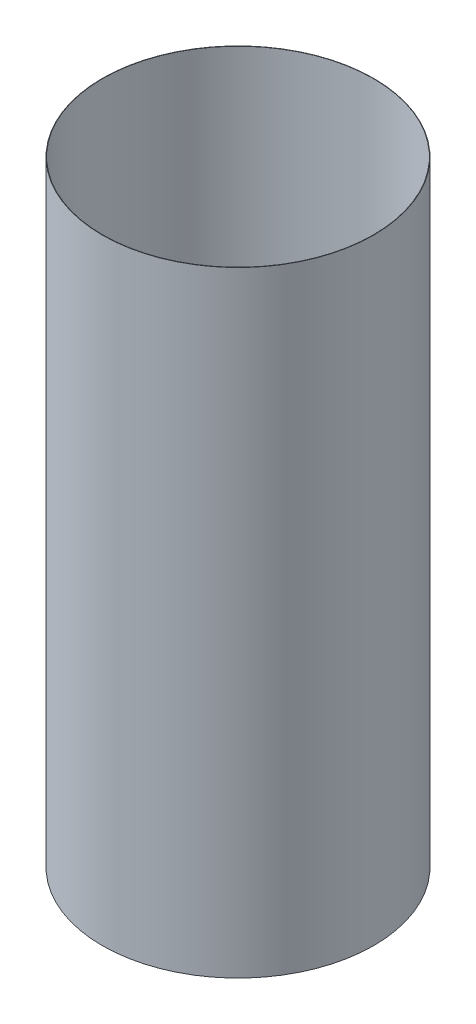
ISO-10303-21;
HEADER;
FILE_DESCRIPTION(('STEP AP214'),'2;1');
FILE_NAME('part.step','',(''),(''),'','','');
FILE_SCHEMA(('AUTOMOTIVE_DESIGN { 1 0 10303 214 1 1 1 1 }'));
ENDSEC;
DATA;
#1=APPLICATION_CONTEXT('core data for automotive mechanical design processes');
#2=APPLICATION_PROTOCOL_DEFINITION('international standard','automotive_design',2000,#1);
#3=PRODUCT_CONTEXT('',#1,'mechanical');
#4=PRODUCT('Part','Part','',(#3));
#5=PRODUCT_RELATED_PRODUCT_CATEGORY('part','',(#4));
#6=PRODUCT_DEFINITION_FORMATION('','',#4);
#7=PRODUCT_DEFINITION_CONTEXT('part definition',#1,'design');
#8=PRODUCT_DEFINITION('design','',#6,#7);
#9=PRODUCT_DEFINITION_SHAPE('','',#8);
#10=(LENGTH_UNIT() NAMED_UNIT(*) SI_UNIT(.MILLI.,.METRE.));
#11=(NAMED_UNIT(*) PLANE_ANGLE_UNIT() SI_UNIT($,.RADIAN.));
#12=(NAMED_UNIT(*) SI_UNIT($,.STERADIAN.) SOLID_ANGLE_UNIT());
#13=UNCERTAINTY_MEASURE_WITH_UNIT(LENGTH_MEASURE(1.E-05),#10,'distance_accuracy_value','');
#14=(GEOMETRIC_REPRESENTATION_CONTEXT(3) GLOBAL_UNCERTAINTY_ASSIGNED_CONTEXT((#13)) GLOBAL_UNIT_ASSIGNED_CONTEXT((#10,
#11,#12)) REPRESENTATION_CONTEXT('',''));
#15=CARTESIAN_POINT('',(0.,0.,0.));
#16=DIRECTION('',(0.,0.,1.));
#17=DIRECTION('',(1.,0.,0.));
#18=AXIS2_PLACEMENT_3D('',#15,#16,#17);
#19=CARTESIAN_POINT('',(0.,107.95,0.));
#20=DIRECTION('',(0.,1.,0.));
#21=DIRECTION('',(0.,0.,1.));
#22=AXIS2_PLACEMENT_3D('',#19,#20,#21);
#23=PLANE('',#22);
#24=CARTESIAN_POINT('',(0.,107.95,0.));
#25=DIRECTION('',(0.,1.,0.));
#26=DIRECTION('',(0.,0.,1.));
#27=AXIS2_PLACEMENT_3D('',#24,#25,#26);
#28=CIRCLE('',#27,23.8125);
#29=CARTESIAN_POINT('',(0.,107.95,23.8125));
#30=VERTEX_POINT('',#29);
#31=EDGE_CURVE('E10',#30,#30,#28,.T.);
#32=ORIENTED_EDGE('',*,*,#31,.T.);
#33=EDGE_LOOP('',(#32));
#34=FACE_BOUND('',#33,.T.);
#35=CARTESIAN_POINT('',(0.,107.95,0.));
#36=DIRECTION('',(0.,1.,0.));
#37=DIRECTION('',(0.,0.,1.));
#38=AXIS2_PLACEMENT_3D('',#35,#36,#37);
#39=CIRCLE('',#38,23.749);
#40=CARTESIAN_POINT('',(0.,107.95,23.749));
#41=VERTEX_POINT('',#40);
#42=EDGE_CURVE('E48',#41,#41,#39,.T.);
#43=ORIENTED_EDGE('',*,*,#42,.F.);
#44=EDGE_LOOP('',(#43));
#45=FACE_BOUND('',#44,.T.);
#46=ADVANCED_FACE('F37',(#34,#45),#23,.T.);
#47=CARTESIAN_POINT('',(0.,0.,0.));
#48=DIRECTION('',(0.,1.,0.));
#49=DIRECTION('',(0.,0.,1.));
#50=AXIS2_PLACEMENT_3D('',#47,#48,#49);
#51=PLANE('',#50);
#52=CARTESIAN_POINT('',(0.,0.,0.));
#53=DIRECTION('',(0.,1.,0.));
#54=DIRECTION('',(0.,0.,1.));
#55=AXIS2_PLACEMENT_3D('',#52,#53,#54);
#56=CIRCLE('',#55,23.8125);
#57=CARTESIAN_POINT('',(0.,0.,23.8125));
#58=VERTEX_POINT('',#57);
#59=EDGE_CURVE('E41',#58,#58,#56,.T.);
#60=ORIENTED_EDGE('',*,*,#59,.F.);
#61=EDGE_LOOP('',(#60));
#62=FACE_BOUND('',#61,.T.);
#63=CARTESIAN_POINT('',(0.,0.,0.));
#64=DIRECTION('',(0.,1.,0.));
#65=DIRECTION('',(0.,0.,1.));
#66=AXIS2_PLACEMENT_3D('',#63,#64,#65);
#67=CIRCLE('',#66,23.749);
#68=CARTESIAN_POINT('',(0.,0.,23.749));
#69=VERTEX_POINT('',#68);
#70=EDGE_CURVE('E50',#69,#69,#67,.T.);
#71=ORIENTED_EDGE('',*,*,#70,.T.);
#72=EDGE_LOOP('',(#71));
#73=FACE_BOUND('',#72,.T.);
#74=ADVANCED_FACE('F60',(#62,#73),#51,.F.);
#75=CARTESIAN_POINT('',(0.,107.95,0.));
#76=DIRECTION('',(0.,-1.,0.));
#77=DIRECTION('',(0.,0.,-1.));
#78=AXIS2_PLACEMENT_3D('',#75,#76,#77);
#79=CYLINDRICAL_SURFACE('',#78,23.8125);
#80=ORIENTED_EDGE('',*,*,#31,.F.);
#81=EDGE_LOOP('',(#80));
#82=FACE_BOUND('',#81,.T.);
#83=ORIENTED_EDGE('',*,*,#59,.T.);
#84=EDGE_LOOP('',(#83));
#85=FACE_BOUND('',#84,.T.);
#86=ADVANCED_FACE('F39',(#82,#85),#79,.T.);
#87=CARTESIAN_POINT('',(0.,107.95,0.));
#88=DIRECTION('',(0.,-1.,0.));
#89=DIRECTION('',(0.,0.,-1.));
#90=AXIS2_PLACEMENT_3D('',#87,#88,#89);
#91=CYLINDRICAL_SURFACE('',#90,23.749);
#92=ORIENTED_EDGE('',*,*,#42,.T.);
#93=EDGE_LOOP('',(#92));
#94=FACE_BOUND('',#93,.T.);
#95=ORIENTED_EDGE('',*,*,#70,.F.);
#96=EDGE_LOOP('',(#95));
#97=FACE_BOUND('',#96,.T.);
#98=ADVANCED_FACE('F56',(#94,#97),#91,.F.);
#99=CLOSED_SHELL('',(#46,#74,#86,#98));
#100=MANIFOLD_SOLID_BREP('B2',#99);
#101=ADVANCED_BREP_SHAPE_REPRESENTATION('',(#18,#100),#14);
#102=SHAPE_DEFINITION_REPRESENTATION(#9,#101);
ENDSEC;
END-ISO-10303-21;
